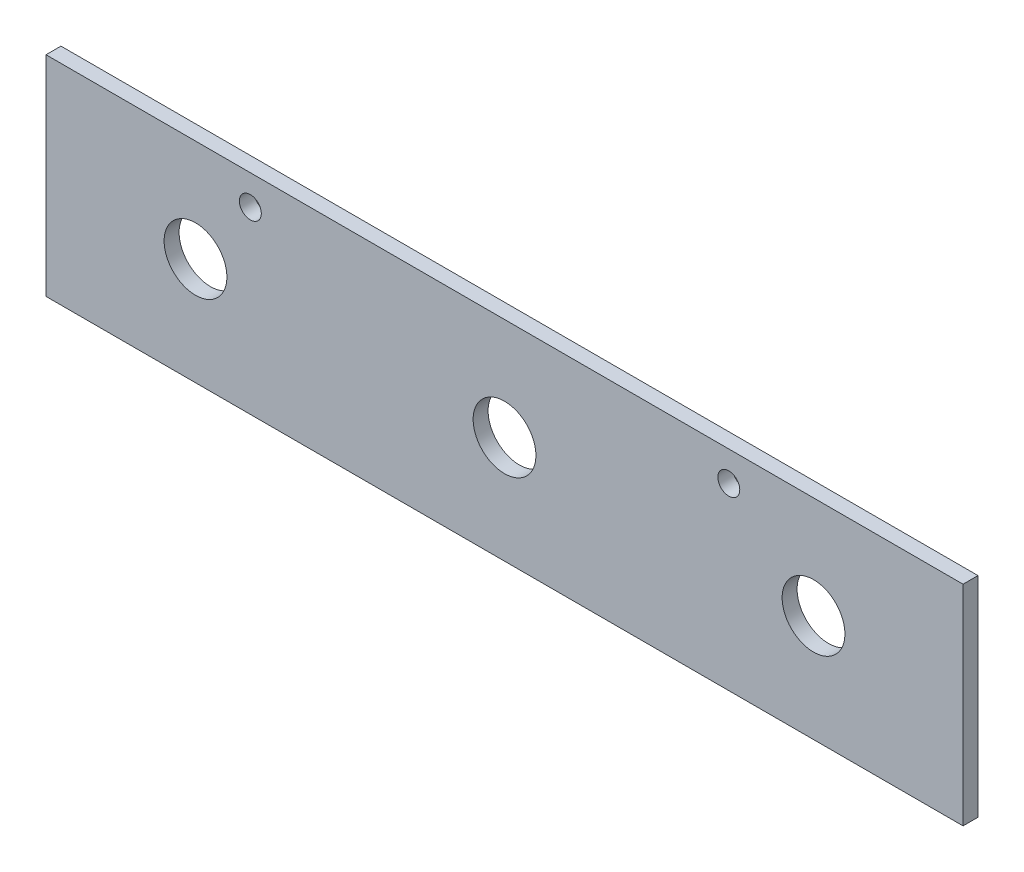
ISO-10303-21;
HEADER;
FILE_DESCRIPTION(('STEP AP214'),'2;1');
FILE_NAME('part.step','',(''),(''),'','','');
FILE_SCHEMA(('AUTOMOTIVE_DESIGN { 1 0 10303 214 1 1 1 1 }'));
ENDSEC;
DATA;
#1=APPLICATION_CONTEXT('core data for automotive mechanical design processes');
#2=APPLICATION_PROTOCOL_DEFINITION('international standard','automotive_design',2000,#1);
#3=PRODUCT_CONTEXT('',#1,'mechanical');
#4=PRODUCT('Part','Part','',(#3));
#5=PRODUCT_RELATED_PRODUCT_CATEGORY('part','',(#4));
#6=PRODUCT_DEFINITION_FORMATION('','',#4);
#7=PRODUCT_DEFINITION_CONTEXT('part definition',#1,'design');
#8=PRODUCT_DEFINITION('design','',#6,#7);
#9=PRODUCT_DEFINITION_SHAPE('','',#8);
#10=(LENGTH_UNIT() NAMED_UNIT(*) SI_UNIT(.MILLI.,.METRE.));
#11=(NAMED_UNIT(*) PLANE_ANGLE_UNIT() SI_UNIT($,.RADIAN.));
#12=(NAMED_UNIT(*) SI_UNIT($,.STERADIAN.) SOLID_ANGLE_UNIT());
#13=UNCERTAINTY_MEASURE_WITH_UNIT(LENGTH_MEASURE(1.E-05),#10,'distance_accuracy_value','');
#14=(GEOMETRIC_REPRESENTATION_CONTEXT(3) GLOBAL_UNCERTAINTY_ASSIGNED_CONTEXT((#13)) GLOBAL_UNIT_ASSIGNED_CONTEXT((#10,
#11,#12)) REPRESENTATION_CONTEXT('',''));
#15=CARTESIAN_POINT('',(0.,0.,0.));
#16=DIRECTION('',(0.,0.,1.));
#17=DIRECTION('',(1.,0.,0.));
#18=AXIS2_PLACEMENT_3D('',#15,#16,#17);
#19=CARTESIAN_POINT('',(0.,0.,3.));
#20=DIRECTION('',(0.,0.,1.));
#21=DIRECTION('',(1.,0.,0.));
#22=AXIS2_PLACEMENT_3D('',#19,#20,#21);
#23=PLANE('',#22);
#24=CARTESIAN_POINT('',(-51.,43.,3.));
#25=DIRECTION('',(0.,0.,1.));
#26=DIRECTION('',(1.,0.,0.));
#27=AXIS2_PLACEMENT_3D('',#24,#25,#26);
#28=CIRCLE('',#27,2.2);
#29=CARTESIAN_POINT('',(-48.8,43.,3.));
#30=VERTEX_POINT('',#29);
#31=EDGE_CURVE('E157',#30,#30,#28,.T.);
#32=ORIENTED_EDGE('',*,*,#31,.F.);
#33=EDGE_LOOP('',(#32));
#34=FACE_BOUND('',#33,.T.);
#35=CARTESIAN_POINT('',(0.,28.5,3.));
#36=DIRECTION('',(0.,0.,1.));
#37=DIRECTION('',(1.,0.,0.));
#38=AXIS2_PLACEMENT_3D('',#35,#36,#37);
#39=CIRCLE('',#38,6.3);
#40=CARTESIAN_POINT('',(6.3,28.5,3.));
#41=VERTEX_POINT('',#40);
#42=EDGE_CURVE('E143',#41,#41,#39,.T.);
#43=ORIENTED_EDGE('',*,*,#42,.F.);
#44=EDGE_LOOP('',(#43));
#45=FACE_BOUND('',#44,.T.);
#46=DIRECTION('',(0.,-1.,0.));
#47=VECTOR('',#46,1.);
#48=CARTESIAN_POINT('',(-92.,49.,3.));
#49=LINE('',#48,#47);
#50=CARTESIAN_POINT('',(-92.,49.,3.));
#51=VERTEX_POINT('',#50);
#52=CARTESIAN_POINT('',(-92.,7.,3.));
#53=VERTEX_POINT('',#52);
#54=EDGE_CURVE('E98',#51,#53,#49,.T.);
#55=ORIENTED_EDGE('',*,*,#54,.T.);
#56=DIRECTION('',(1.,0.,0.));
#57=VECTOR('',#56,1.);
#58=CARTESIAN_POINT('',(-92.,7.,3.));
#59=LINE('',#58,#57);
#60=CARTESIAN_POINT('',(92.,7.,3.));
#61=VERTEX_POINT('',#60);
#62=EDGE_CURVE('E93',#53,#61,#59,.T.);
#63=ORIENTED_EDGE('',*,*,#62,.T.);
#64=DIRECTION('',(0.,1.,0.));
#65=VECTOR('',#64,1.);
#66=CARTESIAN_POINT('',(92.,7.,3.));
#67=LINE('',#66,#65);
#68=CARTESIAN_POINT('',(92.,49.,3.));
#69=VERTEX_POINT('',#68);
#70=EDGE_CURVE('E96',#61,#69,#67,.T.);
#71=ORIENTED_EDGE('',*,*,#70,.T.);
#72=DIRECTION('',(-1.,0.,0.));
#73=VECTOR('',#72,1.);
#74=CARTESIAN_POINT('',(92.,49.,3.));
#75=LINE('',#74,#73);
#76=EDGE_CURVE('E63',#69,#51,#75,.T.);
#77=ORIENTED_EDGE('',*,*,#76,.T.);
#78=EDGE_LOOP('',(#55,#63,#71,#77));
#79=FACE_BOUND('',#78,.T.);
#80=CARTESIAN_POINT('',(-62.,28.5,3.));
#81=DIRECTION('',(0.,0.,1.));
#82=DIRECTION('',(1.,0.,0.));
#83=AXIS2_PLACEMENT_3D('',#80,#81,#82);
#84=CIRCLE('',#83,6.3);
#85=CARTESIAN_POINT('',(-55.7,28.5,3.));
#86=VERTEX_POINT('',#85);
#87=EDGE_CURVE('E119',#86,#86,#84,.T.);
#88=ORIENTED_EDGE('',*,*,#87,.F.);
#89=EDGE_LOOP('',(#88));
#90=FACE_BOUND('',#89,.T.);
#91=CARTESIAN_POINT('',(62.,28.5,3.));
#92=DIRECTION('',(0.,0.,1.));
#93=DIRECTION('',(1.,0.,0.));
#94=AXIS2_PLACEMENT_3D('',#91,#92,#93);
#95=CIRCLE('',#94,6.3);
#96=CARTESIAN_POINT('',(68.3,28.5,3.));
#97=VERTEX_POINT('',#96);
#98=EDGE_CURVE('E150',#97,#97,#95,.T.);
#99=ORIENTED_EDGE('',*,*,#98,.F.);
#100=EDGE_LOOP('',(#99));
#101=FACE_BOUND('',#100,.T.);
#102=CARTESIAN_POINT('',(45.,43.,3.));
#103=DIRECTION('',(0.,0.,1.));
#104=DIRECTION('',(1.,0.,0.));
#105=AXIS2_PLACEMENT_3D('',#102,#103,#104);
#106=CIRCLE('',#105,2.2);
#107=CARTESIAN_POINT('',(47.2,43.,3.));
#108=VERTEX_POINT('',#107);
#109=EDGE_CURVE('E165',#108,#108,#106,.T.);
#110=ORIENTED_EDGE('',*,*,#109,.F.);
#111=EDGE_LOOP('',(#110));
#112=FACE_BOUND('',#111,.T.);
#113=ADVANCED_FACE('F45',(#34,#45,#79,#90,#101,#112),#23,.T.);
#114=CARTESIAN_POINT('',(0.,0.,0.));
#115=DIRECTION('',(0.,0.,1.));
#116=DIRECTION('',(1.,0.,0.));
#117=AXIS2_PLACEMENT_3D('',#114,#115,#116);
#118=PLANE('',#117);
#119=DIRECTION('',(0.,-1.,0.));
#120=VECTOR('',#119,1.);
#121=CARTESIAN_POINT('',(-92.,49.,0.));
#122=LINE('',#121,#120);
#123=CARTESIAN_POINT('',(-92.,49.,0.));
#124=VERTEX_POINT('',#123);
#125=CARTESIAN_POINT('',(-92.,7.,0.));
#126=VERTEX_POINT('',#125);
#127=EDGE_CURVE('E115',#124,#126,#122,.T.);
#128=ORIENTED_EDGE('',*,*,#127,.F.);
#129=DIRECTION('',(-1.,0.,0.));
#130=VECTOR('',#129,1.);
#131=CARTESIAN_POINT('',(92.,49.,0.));
#132=LINE('',#131,#130);
#133=CARTESIAN_POINT('',(92.,49.,0.));
#134=VERTEX_POINT('',#133);
#135=EDGE_CURVE('E86',#134,#124,#132,.T.);
#136=ORIENTED_EDGE('',*,*,#135,.F.);
#137=DIRECTION('',(0.,1.,0.));
#138=VECTOR('',#137,1.);
#139=CARTESIAN_POINT('',(92.,7.,0.));
#140=LINE('',#139,#138);
#141=CARTESIAN_POINT('',(92.,7.,0.));
#142=VERTEX_POINT('',#141);
#143=EDGE_CURVE('E80',#142,#134,#140,.T.);
#144=ORIENTED_EDGE('',*,*,#143,.F.);
#145=DIRECTION('',(1.,0.,0.));
#146=VECTOR('',#145,1.);
#147=CARTESIAN_POINT('',(-92.,7.,0.));
#148=LINE('',#147,#146);
#149=EDGE_CURVE('E103',#126,#142,#148,.T.);
#150=ORIENTED_EDGE('',*,*,#149,.F.);
#151=EDGE_LOOP('',(#128,#136,#144,#150));
#152=FACE_BOUND('',#151,.T.);
#153=CARTESIAN_POINT('',(-62.,28.5,0.));
#154=DIRECTION('',(0.,0.,1.));
#155=DIRECTION('',(1.,0.,0.));
#156=AXIS2_PLACEMENT_3D('',#153,#154,#155);
#157=CIRCLE('',#156,6.3);
#158=CARTESIAN_POINT('',(-55.7,28.5,0.));
#159=VERTEX_POINT('',#158);
#160=EDGE_CURVE('E139',#159,#159,#157,.T.);
#161=ORIENTED_EDGE('',*,*,#160,.T.);
#162=EDGE_LOOP('',(#161));
#163=FACE_BOUND('',#162,.T.);
#164=CARTESIAN_POINT('',(0.,28.5,0.));
#165=DIRECTION('',(0.,0.,1.));
#166=DIRECTION('',(1.,0.,0.));
#167=AXIS2_PLACEMENT_3D('',#164,#165,#166);
#168=CIRCLE('',#167,6.3);
#169=CARTESIAN_POINT('',(6.3,28.5,0.));
#170=VERTEX_POINT('',#169);
#171=EDGE_CURVE('E146',#170,#170,#168,.T.);
#172=ORIENTED_EDGE('',*,*,#171,.T.);
#173=EDGE_LOOP('',(#172));
#174=FACE_BOUND('',#173,.T.);
#175=CARTESIAN_POINT('',(62.,28.5,0.));
#176=DIRECTION('',(0.,0.,1.));
#177=DIRECTION('',(1.,0.,0.));
#178=AXIS2_PLACEMENT_3D('',#175,#176,#177);
#179=CIRCLE('',#178,6.3);
#180=CARTESIAN_POINT('',(68.3,28.5,0.));
#181=VERTEX_POINT('',#180);
#182=EDGE_CURVE('E154',#181,#181,#179,.T.);
#183=ORIENTED_EDGE('',*,*,#182,.T.);
#184=EDGE_LOOP('',(#183));
#185=FACE_BOUND('',#184,.T.);
#186=CARTESIAN_POINT('',(-51.,43.,0.));
#187=DIRECTION('',(0.,0.,1.));
#188=DIRECTION('',(1.,0.,0.));
#189=AXIS2_PLACEMENT_3D('',#186,#187,#188);
#190=CIRCLE('',#189,2.2);
#191=CARTESIAN_POINT('',(-48.8,43.,0.));
#192=VERTEX_POINT('',#191);
#193=EDGE_CURVE('E161',#192,#192,#190,.T.);
#194=ORIENTED_EDGE('',*,*,#193,.T.);
#195=EDGE_LOOP('',(#194));
#196=FACE_BOUND('',#195,.T.);
#197=CARTESIAN_POINT('',(45.,43.,0.));
#198=DIRECTION('',(0.,0.,1.));
#199=DIRECTION('',(1.,0.,0.));
#200=AXIS2_PLACEMENT_3D('',#197,#198,#199);
#201=CIRCLE('',#200,2.2);
#202=CARTESIAN_POINT('',(47.2,43.,0.));
#203=VERTEX_POINT('',#202);
#204=EDGE_CURVE('E169',#203,#203,#201,.T.);
#205=ORIENTED_EDGE('',*,*,#204,.T.);
#206=EDGE_LOOP('',(#205));
#207=FACE_BOUND('',#206,.T.);
#208=ADVANCED_FACE('F133',(#152,#163,#174,#185,#196,#207),#118,.F.);
#209=CARTESIAN_POINT('',(-92.,49.,3.));
#210=DIRECTION('',(1.,0.,0.));
#211=DIRECTION('',(0.,0.,-1.));
#212=AXIS2_PLACEMENT_3D('',#209,#210,#211);
#213=PLANE('',#212);
#214=ORIENTED_EDGE('',*,*,#127,.T.);
#215=DIRECTION('',(0.,0.,-1.));
#216=VECTOR('',#215,1.);
#217=CARTESIAN_POINT('',(-92.,7.,3.));
#218=LINE('',#217,#216);
#219=EDGE_CURVE('E11',#53,#126,#218,.T.);
#220=ORIENTED_EDGE('',*,*,#219,.F.);
#221=ORIENTED_EDGE('',*,*,#54,.F.);
#222=DIRECTION('',(0.,0.,-1.));
#223=VECTOR('',#222,1.);
#224=CARTESIAN_POINT('',(-92.,49.,3.));
#225=LINE('',#224,#223);
#226=EDGE_CURVE('E111',#51,#124,#225,.T.);
#227=ORIENTED_EDGE('',*,*,#226,.T.);
#228=EDGE_LOOP('',(#214,#220,#221,#227));
#229=FACE_BOUND('',#228,.T.);
#230=ADVANCED_FACE('F47',(#229),#213,.F.);
#231=CARTESIAN_POINT('',(-92.,7.,3.));
#232=DIRECTION('',(0.,1.,0.));
#233=DIRECTION('',(0.,0.,1.));
#234=AXIS2_PLACEMENT_3D('',#231,#232,#233);
#235=PLANE('',#234);
#236=ORIENTED_EDGE('',*,*,#149,.T.);
#237=DIRECTION('',(0.,0.,-1.));
#238=VECTOR('',#237,1.);
#239=CARTESIAN_POINT('',(92.,7.,3.));
#240=LINE('',#239,#238);
#241=EDGE_CURVE('E55',#61,#142,#240,.T.);
#242=ORIENTED_EDGE('',*,*,#241,.F.);
#243=ORIENTED_EDGE('',*,*,#62,.F.);
#244=ORIENTED_EDGE('',*,*,#219,.T.);
#245=EDGE_LOOP('',(#236,#242,#243,#244));
#246=FACE_BOUND('',#245,.T.);
#247=ADVANCED_FACE('F102',(#246),#235,.F.);
#248=CARTESIAN_POINT('',(92.,7.,3.));
#249=DIRECTION('',(-1.,0.,0.));
#250=DIRECTION('',(0.,0.,1.));
#251=AXIS2_PLACEMENT_3D('',#248,#249,#250);
#252=PLANE('',#251);
#253=ORIENTED_EDGE('',*,*,#143,.T.);
#254=DIRECTION('',(0.,0.,-1.));
#255=VECTOR('',#254,1.);
#256=CARTESIAN_POINT('',(92.,49.,3.));
#257=LINE('',#256,#255);
#258=EDGE_CURVE('E105',#69,#134,#257,.T.);
#259=ORIENTED_EDGE('',*,*,#258,.F.);
#260=ORIENTED_EDGE('',*,*,#70,.F.);
#261=ORIENTED_EDGE('',*,*,#241,.T.);
#262=EDGE_LOOP('',(#253,#259,#260,#261));
#263=FACE_BOUND('',#262,.T.);
#264=ADVANCED_FACE('F106',(#263),#252,.F.);
#265=CARTESIAN_POINT('',(92.,49.,3.));
#266=DIRECTION('',(0.,-1.,0.));
#267=DIRECTION('',(0.,0.,-1.));
#268=AXIS2_PLACEMENT_3D('',#265,#266,#267);
#269=PLANE('',#268);
#270=ORIENTED_EDGE('',*,*,#135,.T.);
#271=ORIENTED_EDGE('',*,*,#226,.F.);
#272=ORIENTED_EDGE('',*,*,#76,.F.);
#273=ORIENTED_EDGE('',*,*,#258,.T.);
#274=EDGE_LOOP('',(#270,#271,#272,#273));
#275=FACE_BOUND('',#274,.T.);
#276=ADVANCED_FACE('F130',(#275),#269,.F.);
#277=CARTESIAN_POINT('',(-62.,28.5,3.));
#278=DIRECTION('',(0.,0.,-1.));
#279=DIRECTION('',(-1.,0.,0.));
#280=AXIS2_PLACEMENT_3D('',#277,#278,#279);
#281=CYLINDRICAL_SURFACE('',#280,6.3);
#282=ORIENTED_EDGE('',*,*,#87,.T.);
#283=EDGE_LOOP('',(#282));
#284=FACE_BOUND('',#283,.T.);
#285=ORIENTED_EDGE('',*,*,#160,.F.);
#286=EDGE_LOOP('',(#285));
#287=FACE_BOUND('',#286,.T.);
#288=ADVANCED_FACE('F188',(#284,#287),#281,.F.);
#289=CARTESIAN_POINT('',(0.,28.5,3.));
#290=DIRECTION('',(0.,0.,-1.));
#291=DIRECTION('',(-1.,0.,0.));
#292=AXIS2_PLACEMENT_3D('',#289,#290,#291);
#293=CYLINDRICAL_SURFACE('',#292,6.3);
#294=ORIENTED_EDGE('',*,*,#42,.T.);
#295=EDGE_LOOP('',(#294));
#296=FACE_BOUND('',#295,.T.);
#297=ORIENTED_EDGE('',*,*,#171,.F.);
#298=EDGE_LOOP('',(#297));
#299=FACE_BOUND('',#298,.T.);
#300=ADVANCED_FACE('F239',(#296,#299),#293,.F.);
#301=CARTESIAN_POINT('',(62.,28.5,3.));
#302=DIRECTION('',(0.,0.,-1.));
#303=DIRECTION('',(-1.,0.,0.));
#304=AXIS2_PLACEMENT_3D('',#301,#302,#303);
#305=CYLINDRICAL_SURFACE('',#304,6.3);
#306=ORIENTED_EDGE('',*,*,#98,.T.);
#307=EDGE_LOOP('',(#306));
#308=FACE_BOUND('',#307,.T.);
#309=ORIENTED_EDGE('',*,*,#182,.F.);
#310=EDGE_LOOP('',(#309));
#311=FACE_BOUND('',#310,.T.);
#312=ADVANCED_FACE('F248',(#308,#311),#305,.F.);
#313=CARTESIAN_POINT('',(-51.,43.,3.));
#314=DIRECTION('',(0.,0.,-1.));
#315=DIRECTION('',(-1.,0.,0.));
#316=AXIS2_PLACEMENT_3D('',#313,#314,#315);
#317=CYLINDRICAL_SURFACE('',#316,2.2);
#318=ORIENTED_EDGE('',*,*,#31,.T.);
#319=EDGE_LOOP('',(#318));
#320=FACE_BOUND('',#319,.T.);
#321=ORIENTED_EDGE('',*,*,#193,.F.);
#322=EDGE_LOOP('',(#321));
#323=FACE_BOUND('',#322,.T.);
#324=ADVANCED_FACE('F257',(#320,#323),#317,.F.);
#325=CARTESIAN_POINT('',(45.,43.,3.));
#326=DIRECTION('',(0.,0.,-1.));
#327=DIRECTION('',(-1.,0.,0.));
#328=AXIS2_PLACEMENT_3D('',#325,#326,#327);
#329=CYLINDRICAL_SURFACE('',#328,2.2);
#330=ORIENTED_EDGE('',*,*,#109,.T.);
#331=EDGE_LOOP('',(#330));
#332=FACE_BOUND('',#331,.T.);
#333=ORIENTED_EDGE('',*,*,#204,.F.);
#334=EDGE_LOOP('',(#333));
#335=FACE_BOUND('',#334,.T.);
#336=ADVANCED_FACE('F176',(#332,#335),#329,.F.);
#337=CLOSED_SHELL('',(#113,#208,#230,#247,#264,#276,#288,#300,#312,#324,#336));
#338=MANIFOLD_SOLID_BREP('B2',#337);
#339=ADVANCED_BREP_SHAPE_REPRESENTATION('',(#18,#338),#14);
#340=SHAPE_DEFINITION_REPRESENTATION(#9,#339);
ENDSEC;
END-ISO-10303-21;
